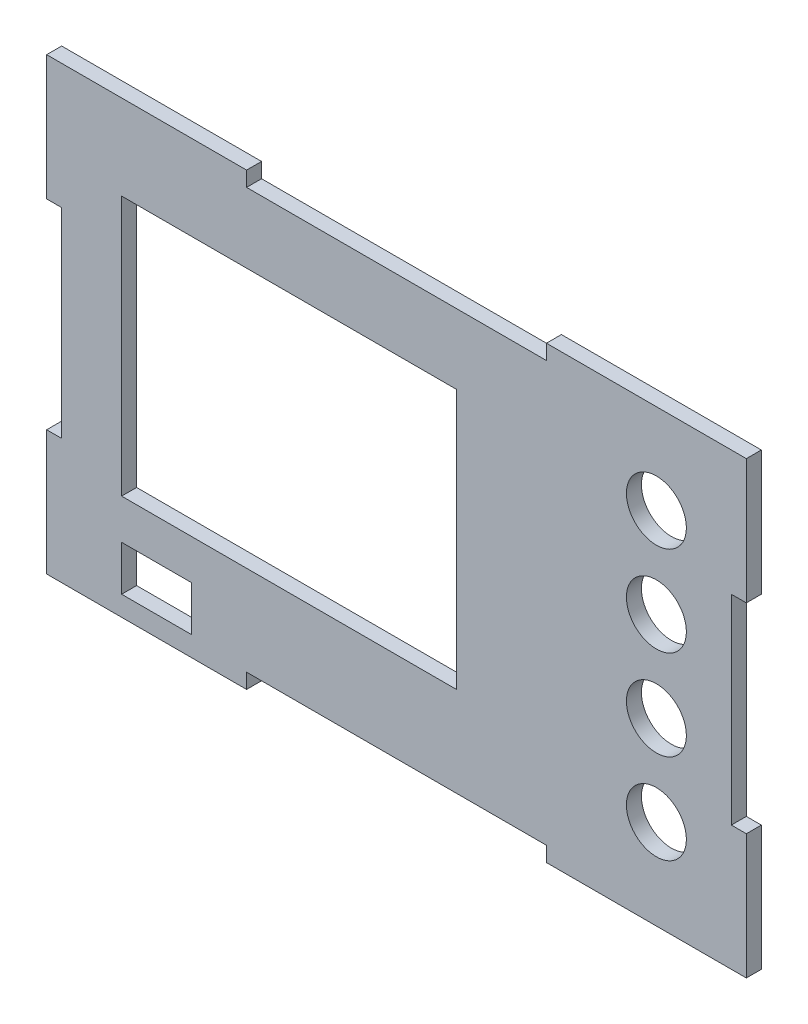
ISO-10303-21;
HEADER;
FILE_DESCRIPTION(('STEP AP214'),'2;1');
FILE_NAME('part.step','',(''),(''),'','','');
FILE_SCHEMA(('AUTOMOTIVE_DESIGN { 1 0 10303 214 1 1 1 1 }'));
ENDSEC;
DATA;
#1=APPLICATION_CONTEXT('core data for automotive mechanical design processes');
#2=APPLICATION_PROTOCOL_DEFINITION('international standard','automotive_design',2000,#1);
#3=PRODUCT_CONTEXT('',#1,'mechanical');
#4=PRODUCT('Part','Part','',(#3));
#5=PRODUCT_RELATED_PRODUCT_CATEGORY('part','',(#4));
#6=PRODUCT_DEFINITION_FORMATION('','',#4);
#7=PRODUCT_DEFINITION_CONTEXT('part definition',#1,'design');
#8=PRODUCT_DEFINITION('design','',#6,#7);
#9=PRODUCT_DEFINITION_SHAPE('','',#8);
#10=(LENGTH_UNIT() NAMED_UNIT(*) SI_UNIT(.MILLI.,.METRE.));
#11=(NAMED_UNIT(*) PLANE_ANGLE_UNIT() SI_UNIT($,.RADIAN.));
#12=(NAMED_UNIT(*) SI_UNIT($,.STERADIAN.) SOLID_ANGLE_UNIT());
#13=UNCERTAINTY_MEASURE_WITH_UNIT(LENGTH_MEASURE(1.E-05),#10,'distance_accuracy_value','');
#14=(GEOMETRIC_REPRESENTATION_CONTEXT(3) GLOBAL_UNCERTAINTY_ASSIGNED_CONTEXT((#13)) GLOBAL_UNIT_ASSIGNED_CONTEXT((#10,
#11,#12)) REPRESENTATION_CONTEXT('',''));
#15=CARTESIAN_POINT('',(0.,0.,0.));
#16=DIRECTION('',(0.,0.,1.));
#17=DIRECTION('',(1.,0.,0.));
#18=AXIS2_PLACEMENT_3D('',#15,#16,#17);
#19=CARTESIAN_POINT('',(0.,0.,3.));
#20=DIRECTION('',(1.,0.,0.));
#21=DIRECTION('',(0.,0.,-1.));
#22=AXIS2_PLACEMENT_3D('',#19,#20,#21);
#23=PLANE('',#22);
#24=DIRECTION('',(0.,-1.,0.));
#25=VECTOR('',#24,1.);
#26=CARTESIAN_POINT('',(0.,0.,0.));
#27=LINE('',#26,#25);
#28=CARTESIAN_POINT('',(0.,25.,0.));
#29=VERTEX_POINT('',#28);
#30=CARTESIAN_POINT('',(0.,0.,0.));
#31=VERTEX_POINT('',#30);
#32=EDGE_CURVE('E311',#29,#31,#27,.T.);
#33=ORIENTED_EDGE('',*,*,#32,.T.);
#34=DIRECTION('',(0.,0.,-1.));
#35=VECTOR('',#34,1.);
#36=CARTESIAN_POINT('',(0.,0.,3.));
#37=LINE('',#36,#35);
#38=CARTESIAN_POINT('',(0.,0.,3.));
#39=VERTEX_POINT('',#38);
#40=EDGE_CURVE('E11',#39,#31,#37,.T.);
#41=ORIENTED_EDGE('',*,*,#40,.F.);
#42=DIRECTION('',(0.,-1.,0.));
#43=VECTOR('',#42,1.);
#44=CARTESIAN_POINT('',(0.,0.,3.));
#45=LINE('',#44,#43);
#46=CARTESIAN_POINT('',(0.,25.,3.));
#47=VERTEX_POINT('',#46);
#48=EDGE_CURVE('E321',#47,#39,#45,.T.);
#49=ORIENTED_EDGE('',*,*,#48,.F.);
#50=DIRECTION('',(0.,0.,-1.));
#51=VECTOR('',#50,1.);
#52=CARTESIAN_POINT('',(0.,25.,3.));
#53=LINE('',#52,#51);
#54=EDGE_CURVE('E383',#47,#29,#53,.T.);
#55=ORIENTED_EDGE('',*,*,#54,.T.);
#56=EDGE_LOOP('',(#33,#41,#49,#55));
#57=FACE_BOUND('',#56,.T.);
#58=ADVANCED_FACE('F38',(#57),#23,.F.);
#59=CARTESIAN_POINT('',(0.,0.,3.));
#60=DIRECTION('',(0.,1.,0.));
#61=DIRECTION('',(0.,0.,1.));
#62=AXIS2_PLACEMENT_3D('',#59,#60,#61);
#63=PLANE('',#62);
#64=DIRECTION('',(1.,0.,0.));
#65=VECTOR('',#64,1.);
#66=CARTESIAN_POINT('',(0.,0.,0.));
#67=LINE('',#66,#65);
#68=CARTESIAN_POINT('',(40.,0.,0.));
#69=VERTEX_POINT('',#68);
#70=EDGE_CURVE('E387',#31,#69,#67,.T.);
#71=ORIENTED_EDGE('',*,*,#70,.T.);
#72=DIRECTION('',(0.,0.,-1.));
#73=VECTOR('',#72,1.);
#74=CARTESIAN_POINT('',(40.,0.,3.));
#75=LINE('',#74,#73);
#76=CARTESIAN_POINT('',(40.,0.,3.));
#77=VERTEX_POINT('',#76);
#78=EDGE_CURVE('E46',#77,#69,#75,.T.);
#79=ORIENTED_EDGE('',*,*,#78,.F.);
#80=DIRECTION('',(1.,0.,0.));
#81=VECTOR('',#80,1.);
#82=CARTESIAN_POINT('',(0.,0.,3.));
#83=LINE('',#82,#81);
#84=EDGE_CURVE('E325',#39,#77,#83,.T.);
#85=ORIENTED_EDGE('',*,*,#84,.F.);
#86=ORIENTED_EDGE('',*,*,#40,.T.);
#87=EDGE_LOOP('',(#71,#79,#85,#86));
#88=FACE_BOUND('',#87,.T.);
#89=ADVANCED_FACE('F542',(#88),#63,.F.);
#90=CARTESIAN_POINT('',(40.,0.,3.));
#91=DIRECTION('',(-1.,0.,0.));
#92=DIRECTION('',(0.,0.,1.));
#93=AXIS2_PLACEMENT_3D('',#90,#91,#92);
#94=PLANE('',#93);
#95=DIRECTION('',(0.,1.,0.));
#96=VECTOR('',#95,1.);
#97=CARTESIAN_POINT('',(40.,0.,0.));
#98=LINE('',#97,#96);
#99=CARTESIAN_POINT('',(40.,3.,0.));
#100=VERTEX_POINT('',#99);
#101=EDGE_CURVE('E390',#69,#100,#98,.T.);
#102=ORIENTED_EDGE('',*,*,#101,.T.);
#103=DIRECTION('',(0.,0.,-1.));
#104=VECTOR('',#103,1.);
#105=CARTESIAN_POINT('',(40.,3.,3.));
#106=LINE('',#105,#104);
#107=CARTESIAN_POINT('',(40.,3.,3.));
#108=VERTEX_POINT('',#107);
#109=EDGE_CURVE('E510',#108,#100,#106,.T.);
#110=ORIENTED_EDGE('',*,*,#109,.F.);
#111=DIRECTION('',(0.,1.,0.));
#112=VECTOR('',#111,1.);
#113=CARTESIAN_POINT('',(40.,0.,3.));
#114=LINE('',#113,#112);
#115=EDGE_CURVE('E329',#77,#108,#114,.T.);
#116=ORIENTED_EDGE('',*,*,#115,.F.);
#117=ORIENTED_EDGE('',*,*,#78,.T.);
#118=EDGE_LOOP('',(#102,#110,#116,#117));
#119=FACE_BOUND('',#118,.T.);
#120=ADVANCED_FACE('F520',(#119),#94,.F.);
#121=CARTESIAN_POINT('',(40.,3.,3.));
#122=DIRECTION('',(0.,1.,0.));
#123=DIRECTION('',(-1.,0.,0.));
#124=AXIS2_PLACEMENT_3D('',#121,#122,#123);
#125=PLANE('',#124);
#126=DIRECTION('',(1.,0.,0.));
#127=VECTOR('',#126,1.);
#128=CARTESIAN_POINT('',(40.,3.,0.));
#129=LINE('',#128,#127);
#130=CARTESIAN_POINT('',(100.,3.,0.));
#131=VERTEX_POINT('',#130);
#132=EDGE_CURVE('E393',#100,#131,#129,.T.);
#133=ORIENTED_EDGE('',*,*,#132,.T.);
#134=DIRECTION('',(0.,0.,-1.));
#135=VECTOR('',#134,1.);
#136=CARTESIAN_POINT('',(100.,3.,3.));
#137=LINE('',#136,#135);
#138=CARTESIAN_POINT('',(100.,3.,3.));
#139=VERTEX_POINT('',#138);
#140=EDGE_CURVE('E506',#139,#131,#137,.T.);
#141=ORIENTED_EDGE('',*,*,#140,.F.);
#142=DIRECTION('',(1.,0.,0.));
#143=VECTOR('',#142,1.);
#144=CARTESIAN_POINT('',(40.,3.,3.));
#145=LINE('',#144,#143);
#146=EDGE_CURVE('E332',#108,#139,#145,.T.);
#147=ORIENTED_EDGE('',*,*,#146,.F.);
#148=ORIENTED_EDGE('',*,*,#109,.T.);
#149=EDGE_LOOP('',(#133,#141,#147,#148));
#150=FACE_BOUND('',#149,.T.);
#151=ADVANCED_FACE('F530',(#150),#125,.F.);
#152=CARTESIAN_POINT('',(100.,0.,3.));
#153=DIRECTION('',(1.,0.,0.));
#154=DIRECTION('',(0.,0.,-1.));
#155=AXIS2_PLACEMENT_3D('',#152,#153,#154);
#156=PLANE('',#155);
#157=DIRECTION('',(0.,-1.,0.));
#158=VECTOR('',#157,1.);
#159=CARTESIAN_POINT('',(100.,0.,0.));
#160=LINE('',#159,#158);
#161=CARTESIAN_POINT('',(100.,0.,0.));
#162=VERTEX_POINT('',#161);
#163=EDGE_CURVE('E396',#131,#162,#160,.T.);
#164=ORIENTED_EDGE('',*,*,#163,.T.);
#165=DIRECTION('',(0.,0.,-1.));
#166=VECTOR('',#165,1.);
#167=CARTESIAN_POINT('',(100.,0.,3.));
#168=LINE('',#167,#166);
#169=CARTESIAN_POINT('',(100.,0.,3.));
#170=VERTEX_POINT('',#169);
#171=EDGE_CURVE('E502',#170,#162,#168,.T.);
#172=ORIENTED_EDGE('',*,*,#171,.F.);
#173=DIRECTION('',(0.,-1.,0.));
#174=VECTOR('',#173,1.);
#175=CARTESIAN_POINT('',(100.,0.,3.));
#176=LINE('',#175,#174);
#177=EDGE_CURVE('E335',#139,#170,#176,.T.);
#178=ORIENTED_EDGE('',*,*,#177,.F.);
#179=ORIENTED_EDGE('',*,*,#140,.T.);
#180=EDGE_LOOP('',(#164,#172,#178,#179));
#181=FACE_BOUND('',#180,.T.);
#182=ADVANCED_FACE('F534',(#181),#156,.F.);
#183=CARTESIAN_POINT('',(140.,0.,3.));
#184=DIRECTION('',(0.,1.,0.));
#185=DIRECTION('',(0.,0.,1.));
#186=AXIS2_PLACEMENT_3D('',#183,#184,#185);
#187=PLANE('',#186);
#188=DIRECTION('',(1.,0.,0.));
#189=VECTOR('',#188,1.);
#190=CARTESIAN_POINT('',(140.,0.,0.));
#191=LINE('',#190,#189);
#192=CARTESIAN_POINT('',(140.,0.,0.));
#193=VERTEX_POINT('',#192);
#194=EDGE_CURVE('E399',#162,#193,#191,.T.);
#195=ORIENTED_EDGE('',*,*,#194,.T.);
#196=DIRECTION('',(0.,0.,-1.));
#197=VECTOR('',#196,1.);
#198=CARTESIAN_POINT('',(140.,0.,3.));
#199=LINE('',#198,#197);
#200=CARTESIAN_POINT('',(140.,0.,3.));
#201=VERTEX_POINT('',#200);
#202=EDGE_CURVE('E498',#201,#193,#199,.T.);
#203=ORIENTED_EDGE('',*,*,#202,.F.);
#204=DIRECTION('',(1.,0.,0.));
#205=VECTOR('',#204,1.);
#206=CARTESIAN_POINT('',(140.,0.,3.));
#207=LINE('',#206,#205);
#208=EDGE_CURVE('E338',#170,#201,#207,.T.);
#209=ORIENTED_EDGE('',*,*,#208,.F.);
#210=ORIENTED_EDGE('',*,*,#171,.T.);
#211=EDGE_LOOP('',(#195,#203,#209,#210));
#212=FACE_BOUND('',#211,.T.);
#213=ADVANCED_FACE('F615',(#212),#187,.F.);
#214=CARTESIAN_POINT('',(140.,0.,3.));
#215=DIRECTION('',(-1.,0.,0.));
#216=DIRECTION('',(0.,0.,1.));
#217=AXIS2_PLACEMENT_3D('',#214,#215,#216);
#218=PLANE('',#217);
#219=DIRECTION('',(0.,1.,0.));
#220=VECTOR('',#219,1.);
#221=CARTESIAN_POINT('',(140.,0.,0.));
#222=LINE('',#221,#220);
#223=CARTESIAN_POINT('',(140.,25.,0.));
#224=VERTEX_POINT('',#223);
#225=EDGE_CURVE('E402',#193,#224,#222,.T.);
#226=ORIENTED_EDGE('',*,*,#225,.T.);
#227=DIRECTION('',(0.,0.,-1.));
#228=VECTOR('',#227,1.);
#229=CARTESIAN_POINT('',(140.,25.,3.));
#230=LINE('',#229,#228);
#231=CARTESIAN_POINT('',(140.,25.,3.));
#232=VERTEX_POINT('',#231);
#233=EDGE_CURVE('E494',#232,#224,#230,.T.);
#234=ORIENTED_EDGE('',*,*,#233,.F.);
#235=DIRECTION('',(0.,1.,0.));
#236=VECTOR('',#235,1.);
#237=CARTESIAN_POINT('',(140.,0.,3.));
#238=LINE('',#237,#236);
#239=EDGE_CURVE('E341',#201,#232,#238,.T.);
#240=ORIENTED_EDGE('',*,*,#239,.F.);
#241=ORIENTED_EDGE('',*,*,#202,.T.);
#242=EDGE_LOOP('',(#226,#234,#240,#241));
#243=FACE_BOUND('',#242,.T.);
#244=ADVANCED_FACE('F613',(#243),#218,.F.);
#245=CARTESIAN_POINT('',(140.,25.,3.));
#246=DIRECTION('',(0.,-1.,0.));
#247=DIRECTION('',(0.,0.,-1.));
#248=AXIS2_PLACEMENT_3D('',#245,#246,#247);
#249=PLANE('',#248);
#250=DIRECTION('',(-1.,0.,0.));
#251=VECTOR('',#250,1.);
#252=CARTESIAN_POINT('',(140.,25.,0.));
#253=LINE('',#252,#251);
#254=CARTESIAN_POINT('',(137.,25.,0.));
#255=VERTEX_POINT('',#254);
#256=EDGE_CURVE('E405',#224,#255,#253,.T.);
#257=ORIENTED_EDGE('',*,*,#256,.T.);
#258=DIRECTION('',(0.,0.,-1.));
#259=VECTOR('',#258,1.);
#260=CARTESIAN_POINT('',(137.,25.,3.));
#261=LINE('',#260,#259);
#262=CARTESIAN_POINT('',(137.,25.,3.));
#263=VERTEX_POINT('',#262);
#264=EDGE_CURVE('E490',#263,#255,#261,.T.);
#265=ORIENTED_EDGE('',*,*,#264,.F.);
#266=DIRECTION('',(-1.,0.,0.));
#267=VECTOR('',#266,1.);
#268=CARTESIAN_POINT('',(140.,25.,3.));
#269=LINE('',#268,#267);
#270=EDGE_CURVE('E344',#232,#263,#269,.T.);
#271=ORIENTED_EDGE('',*,*,#270,.F.);
#272=ORIENTED_EDGE('',*,*,#233,.T.);
#273=EDGE_LOOP('',(#257,#265,#271,#272));
#274=FACE_BOUND('',#273,.T.);
#275=ADVANCED_FACE('F608',(#274),#249,.F.);
#276=CARTESIAN_POINT('',(137.,25.,3.));
#277=DIRECTION('',(-1.,0.,0.));
#278=DIRECTION('',(0.,0.,1.));
#279=AXIS2_PLACEMENT_3D('',#276,#277,#278);
#280=PLANE('',#279);
#281=DIRECTION('',(0.,1.,0.));
#282=VECTOR('',#281,1.);
#283=CARTESIAN_POINT('',(137.,25.,0.));
#284=LINE('',#283,#282);
#285=CARTESIAN_POINT('',(137.,65.,0.));
#286=VERTEX_POINT('',#285);
#287=EDGE_CURVE('E408',#255,#286,#284,.T.);
#288=ORIENTED_EDGE('',*,*,#287,.T.);
#289=DIRECTION('',(0.,0.,-1.));
#290=VECTOR('',#289,1.);
#291=CARTESIAN_POINT('',(137.,65.,3.));
#292=LINE('',#291,#290);
#293=CARTESIAN_POINT('',(137.,65.,3.));
#294=VERTEX_POINT('',#293);
#295=EDGE_CURVE('E486',#294,#286,#292,.T.);
#296=ORIENTED_EDGE('',*,*,#295,.F.);
#297=DIRECTION('',(0.,1.,0.));
#298=VECTOR('',#297,1.);
#299=CARTESIAN_POINT('',(137.,25.,3.));
#300=LINE('',#299,#298);
#301=EDGE_CURVE('E347',#263,#294,#300,.T.);
#302=ORIENTED_EDGE('',*,*,#301,.F.);
#303=ORIENTED_EDGE('',*,*,#264,.T.);
#304=EDGE_LOOP('',(#288,#296,#302,#303));
#305=FACE_BOUND('',#304,.T.);
#306=ADVANCED_FACE('F603',(#305),#280,.F.);
#307=CARTESIAN_POINT('',(140.,65.,3.));
#308=DIRECTION('',(0.,1.,0.));
#309=DIRECTION('',(0.,0.,1.));
#310=AXIS2_PLACEMENT_3D('',#307,#308,#309);
#311=PLANE('',#310);
#312=DIRECTION('',(1.,0.,0.));
#313=VECTOR('',#312,1.);
#314=CARTESIAN_POINT('',(140.,65.,0.));
#315=LINE('',#314,#313);
#316=CARTESIAN_POINT('',(140.,65.,0.));
#317=VERTEX_POINT('',#316);
#318=EDGE_CURVE('E411',#286,#317,#315,.T.);
#319=ORIENTED_EDGE('',*,*,#318,.T.);
#320=DIRECTION('',(0.,0.,-1.));
#321=VECTOR('',#320,1.);
#322=CARTESIAN_POINT('',(140.,65.,3.));
#323=LINE('',#322,#321);
#324=CARTESIAN_POINT('',(140.,65.,3.));
#325=VERTEX_POINT('',#324);
#326=EDGE_CURVE('E482',#325,#317,#323,.T.);
#327=ORIENTED_EDGE('',*,*,#326,.F.);
#328=DIRECTION('',(1.,0.,0.));
#329=VECTOR('',#328,1.);
#330=CARTESIAN_POINT('',(140.,65.,3.));
#331=LINE('',#330,#329);
#332=EDGE_CURVE('E350',#294,#325,#331,.T.);
#333=ORIENTED_EDGE('',*,*,#332,.F.);
#334=ORIENTED_EDGE('',*,*,#295,.T.);
#335=EDGE_LOOP('',(#319,#327,#333,#334));
#336=FACE_BOUND('',#335,.T.);
#337=ADVANCED_FACE('F599',(#336),#311,.F.);
#338=CARTESIAN_POINT('',(140.,90.,3.));
#339=DIRECTION('',(-1.,0.,0.));
#340=DIRECTION('',(0.,0.,1.));
#341=AXIS2_PLACEMENT_3D('',#338,#339,#340);
#342=PLANE('',#341);
#343=DIRECTION('',(0.,1.,0.));
#344=VECTOR('',#343,1.);
#345=CARTESIAN_POINT('',(140.,90.,0.));
#346=LINE('',#345,#344);
#347=CARTESIAN_POINT('',(140.,90.,0.));
#348=VERTEX_POINT('',#347);
#349=EDGE_CURVE('E414',#317,#348,#346,.T.);
#350=ORIENTED_EDGE('',*,*,#349,.T.);
#351=DIRECTION('',(0.,0.,-1.));
#352=VECTOR('',#351,1.);
#353=CARTESIAN_POINT('',(140.,90.,3.));
#354=LINE('',#353,#352);
#355=CARTESIAN_POINT('',(140.,90.,3.));
#356=VERTEX_POINT('',#355);
#357=EDGE_CURVE('E478',#356,#348,#354,.T.);
#358=ORIENTED_EDGE('',*,*,#357,.F.);
#359=DIRECTION('',(0.,1.,0.));
#360=VECTOR('',#359,1.);
#361=CARTESIAN_POINT('',(140.,90.,3.));
#362=LINE('',#361,#360);
#363=EDGE_CURVE('E353',#325,#356,#362,.T.);
#364=ORIENTED_EDGE('',*,*,#363,.F.);
#365=ORIENTED_EDGE('',*,*,#326,.T.);
#366=EDGE_LOOP('',(#350,#358,#364,#365));
#367=FACE_BOUND('',#366,.T.);
#368=ADVANCED_FACE('F594',(#367),#342,.F.);
#369=CARTESIAN_POINT('',(140.,90.,3.));
#370=DIRECTION('',(0.,-1.,0.));
#371=DIRECTION('',(0.,0.,-1.));
#372=AXIS2_PLACEMENT_3D('',#369,#370,#371);
#373=PLANE('',#372);
#374=DIRECTION('',(-1.,0.,0.));
#375=VECTOR('',#374,1.);
#376=CARTESIAN_POINT('',(140.,90.,0.));
#377=LINE('',#376,#375);
#378=CARTESIAN_POINT('',(100.,90.,0.));
#379=VERTEX_POINT('',#378);
#380=EDGE_CURVE('E417',#348,#379,#377,.T.);
#381=ORIENTED_EDGE('',*,*,#380,.T.);
#382=DIRECTION('',(0.,0.,-1.));
#383=VECTOR('',#382,1.);
#384=CARTESIAN_POINT('',(100.,90.,3.));
#385=LINE('',#384,#383);
#386=CARTESIAN_POINT('',(100.,90.,3.));
#387=VERTEX_POINT('',#386);
#388=EDGE_CURVE('E474',#387,#379,#385,.T.);
#389=ORIENTED_EDGE('',*,*,#388,.F.);
#390=DIRECTION('',(-1.,0.,0.));
#391=VECTOR('',#390,1.);
#392=CARTESIAN_POINT('',(140.,90.,3.));
#393=LINE('',#392,#391);
#394=EDGE_CURVE('E356',#356,#387,#393,.T.);
#395=ORIENTED_EDGE('',*,*,#394,.F.);
#396=ORIENTED_EDGE('',*,*,#357,.T.);
#397=EDGE_LOOP('',(#381,#389,#395,#396));
#398=FACE_BOUND('',#397,.T.);
#399=ADVANCED_FACE('F588',(#398),#373,.F.);
#400=CARTESIAN_POINT('',(100.,90.,3.));
#401=DIRECTION('',(1.,0.,0.));
#402=DIRECTION('',(0.,0.,-1.));
#403=AXIS2_PLACEMENT_3D('',#400,#401,#402);
#404=PLANE('',#403);
#405=DIRECTION('',(0.,-1.,0.));
#406=VECTOR('',#405,1.);
#407=CARTESIAN_POINT('',(100.,90.,0.));
#408=LINE('',#407,#406);
#409=CARTESIAN_POINT('',(100.,87.,0.));
#410=VERTEX_POINT('',#409);
#411=EDGE_CURVE('E420',#379,#410,#408,.T.);
#412=ORIENTED_EDGE('',*,*,#411,.T.);
#413=DIRECTION('',(0.,0.,-1.));
#414=VECTOR('',#413,1.);
#415=CARTESIAN_POINT('',(100.,87.,3.));
#416=LINE('',#415,#414);
#417=CARTESIAN_POINT('',(100.,87.,3.));
#418=VERTEX_POINT('',#417);
#419=EDGE_CURVE('E470',#418,#410,#416,.T.);
#420=ORIENTED_EDGE('',*,*,#419,.F.);
#421=DIRECTION('',(0.,-1.,0.));
#422=VECTOR('',#421,1.);
#423=CARTESIAN_POINT('',(100.,90.,3.));
#424=LINE('',#423,#422);
#425=EDGE_CURVE('E359',#387,#418,#424,.T.);
#426=ORIENTED_EDGE('',*,*,#425,.F.);
#427=ORIENTED_EDGE('',*,*,#388,.T.);
#428=EDGE_LOOP('',(#412,#420,#426,#427));
#429=FACE_BOUND('',#428,.T.);
#430=ADVANCED_FACE('F584',(#429),#404,.F.);
#431=CARTESIAN_POINT('',(40.,87.,3.));
#432=DIRECTION('',(0.,-1.,0.));
#433=DIRECTION('',(0.,0.,-1.));
#434=AXIS2_PLACEMENT_3D('',#431,#432,#433);
#435=PLANE('',#434);
#436=DIRECTION('',(-1.,0.,0.));
#437=VECTOR('',#436,1.);
#438=CARTESIAN_POINT('',(40.,87.,0.));
#439=LINE('',#438,#437);
#440=CARTESIAN_POINT('',(40.,87.,0.));
#441=VERTEX_POINT('',#440);
#442=EDGE_CURVE('E423',#410,#441,#439,.T.);
#443=ORIENTED_EDGE('',*,*,#442,.T.);
#444=DIRECTION('',(0.,0.,-1.));
#445=VECTOR('',#444,1.);
#446=CARTESIAN_POINT('',(40.,87.,3.));
#447=LINE('',#446,#445);
#448=CARTESIAN_POINT('',(40.,87.,3.));
#449=VERTEX_POINT('',#448);
#450=EDGE_CURVE('E466',#449,#441,#447,.T.);
#451=ORIENTED_EDGE('',*,*,#450,.F.);
#452=DIRECTION('',(-1.,0.,0.));
#453=VECTOR('',#452,1.);
#454=CARTESIAN_POINT('',(40.,87.,3.));
#455=LINE('',#454,#453);
#456=EDGE_CURVE('E362',#418,#449,#455,.T.);
#457=ORIENTED_EDGE('',*,*,#456,.F.);
#458=ORIENTED_EDGE('',*,*,#419,.T.);
#459=EDGE_LOOP('',(#443,#451,#457,#458));
#460=FACE_BOUND('',#459,.T.);
#461=ADVANCED_FACE('F579',(#460),#435,.F.);
#462=CARTESIAN_POINT('',(40.,90.,3.));
#463=DIRECTION('',(-1.,0.,0.));
#464=DIRECTION('',(0.,0.,1.));
#465=AXIS2_PLACEMENT_3D('',#462,#463,#464);
#466=PLANE('',#465);
#467=DIRECTION('',(0.,1.,0.));
#468=VECTOR('',#467,1.);
#469=CARTESIAN_POINT('',(40.,90.,0.));
#470=LINE('',#469,#468);
#471=CARTESIAN_POINT('',(40.,90.,0.));
#472=VERTEX_POINT('',#471);
#473=EDGE_CURVE('E426',#441,#472,#470,.T.);
#474=ORIENTED_EDGE('',*,*,#473,.T.);
#475=DIRECTION('',(0.,0.,-1.));
#476=VECTOR('',#475,1.);
#477=CARTESIAN_POINT('',(40.,90.,3.));
#478=LINE('',#477,#476);
#479=CARTESIAN_POINT('',(40.,90.,3.));
#480=VERTEX_POINT('',#479);
#481=EDGE_CURVE('E462',#480,#472,#478,.T.);
#482=ORIENTED_EDGE('',*,*,#481,.F.);
#483=DIRECTION('',(0.,1.,0.));
#484=VECTOR('',#483,1.);
#485=CARTESIAN_POINT('',(40.,90.,3.));
#486=LINE('',#485,#484);
#487=EDGE_CURVE('E365',#449,#480,#486,.T.);
#488=ORIENTED_EDGE('',*,*,#487,.F.);
#489=ORIENTED_EDGE('',*,*,#450,.T.);
#490=EDGE_LOOP('',(#474,#482,#488,#489));
#491=FACE_BOUND('',#490,.T.);
#492=ADVANCED_FACE('F573',(#491),#466,.F.);
#493=CARTESIAN_POINT('',(0.,90.,3.));
#494=DIRECTION('',(0.,-1.,0.));
#495=DIRECTION('',(0.,0.,-1.));
#496=AXIS2_PLACEMENT_3D('',#493,#494,#495);
#497=PLANE('',#496);
#498=DIRECTION('',(-1.,0.,0.));
#499=VECTOR('',#498,1.);
#500=CARTESIAN_POINT('',(0.,90.,0.));
#501=LINE('',#500,#499);
#502=CARTESIAN_POINT('',(0.,90.,0.));
#503=VERTEX_POINT('',#502);
#504=EDGE_CURVE('E429',#472,#503,#501,.T.);
#505=ORIENTED_EDGE('',*,*,#504,.T.);
#506=DIRECTION('',(0.,0.,-1.));
#507=VECTOR('',#506,1.);
#508=CARTESIAN_POINT('',(0.,90.,3.));
#509=LINE('',#508,#507);
#510=CARTESIAN_POINT('',(0.,90.,3.));
#511=VERTEX_POINT('',#510);
#512=EDGE_CURVE('E458',#511,#503,#509,.T.);
#513=ORIENTED_EDGE('',*,*,#512,.F.);
#514=DIRECTION('',(-1.,0.,0.));
#515=VECTOR('',#514,1.);
#516=CARTESIAN_POINT('',(0.,90.,3.));
#517=LINE('',#516,#515);
#518=EDGE_CURVE('E368',#480,#511,#517,.T.);
#519=ORIENTED_EDGE('',*,*,#518,.F.);
#520=ORIENTED_EDGE('',*,*,#481,.T.);
#521=EDGE_LOOP('',(#505,#513,#519,#520));
#522=FACE_BOUND('',#521,.T.);
#523=ADVANCED_FACE('F569',(#522),#497,.F.);
#524=CARTESIAN_POINT('',(0.,90.,3.));
#525=DIRECTION('',(1.,0.,0.));
#526=DIRECTION('',(0.,0.,-1.));
#527=AXIS2_PLACEMENT_3D('',#524,#525,#526);
#528=PLANE('',#527);
#529=DIRECTION('',(0.,-1.,0.));
#530=VECTOR('',#529,1.);
#531=CARTESIAN_POINT('',(0.,90.,0.));
#532=LINE('',#531,#530);
#533=CARTESIAN_POINT('',(0.,65.,0.));
#534=VERTEX_POINT('',#533);
#535=EDGE_CURVE('E432',#503,#534,#532,.T.);
#536=ORIENTED_EDGE('',*,*,#535,.T.);
#537=DIRECTION('',(0.,0.,-1.));
#538=VECTOR('',#537,1.);
#539=CARTESIAN_POINT('',(0.,65.,3.));
#540=LINE('',#539,#538);
#541=CARTESIAN_POINT('',(0.,65.,3.));
#542=VERTEX_POINT('',#541);
#543=EDGE_CURVE('E454',#542,#534,#540,.T.);
#544=ORIENTED_EDGE('',*,*,#543,.F.);
#545=DIRECTION('',(0.,-1.,0.));
#546=VECTOR('',#545,1.);
#547=CARTESIAN_POINT('',(0.,90.,3.));
#548=LINE('',#547,#546);
#549=EDGE_CURVE('E371',#511,#542,#548,.T.);
#550=ORIENTED_EDGE('',*,*,#549,.F.);
#551=ORIENTED_EDGE('',*,*,#512,.T.);
#552=EDGE_LOOP('',(#536,#544,#550,#551));
#553=FACE_BOUND('',#552,.T.);
#554=ADVANCED_FACE('F564',(#553),#528,.F.);
#555=CARTESIAN_POINT('',(0.,65.,3.));
#556=DIRECTION('',(0.,1.,0.));
#557=DIRECTION('',(0.,0.,1.));
#558=AXIS2_PLACEMENT_3D('',#555,#556,#557);
#559=PLANE('',#558);
#560=DIRECTION('',(1.,0.,0.));
#561=VECTOR('',#560,1.);
#562=CARTESIAN_POINT('',(0.,65.,0.));
#563=LINE('',#562,#561);
#564=CARTESIAN_POINT('',(3.,65.,0.));
#565=VERTEX_POINT('',#564);
#566=EDGE_CURVE('E435',#534,#565,#563,.T.);
#567=ORIENTED_EDGE('',*,*,#566,.T.);
#568=DIRECTION('',(0.,0.,-1.));
#569=VECTOR('',#568,1.);
#570=CARTESIAN_POINT('',(3.,65.,3.));
#571=LINE('',#570,#569);
#572=CARTESIAN_POINT('',(3.,65.,3.));
#573=VERTEX_POINT('',#572);
#574=EDGE_CURVE('E450',#573,#565,#571,.T.);
#575=ORIENTED_EDGE('',*,*,#574,.F.);
#576=DIRECTION('',(1.,0.,0.));
#577=VECTOR('',#576,1.);
#578=CARTESIAN_POINT('',(0.,65.,3.));
#579=LINE('',#578,#577);
#580=EDGE_CURVE('E374',#542,#573,#579,.T.);
#581=ORIENTED_EDGE('',*,*,#580,.F.);
#582=ORIENTED_EDGE('',*,*,#543,.T.);
#583=EDGE_LOOP('',(#567,#575,#581,#582));
#584=FACE_BOUND('',#583,.T.);
#585=ADVANCED_FACE('F558',(#584),#559,.F.);
#586=CARTESIAN_POINT('',(3.,25.,3.));
#587=DIRECTION('',(1.,0.,0.));
#588=DIRECTION('',(0.,0.,-1.));
#589=AXIS2_PLACEMENT_3D('',#586,#587,#588);
#590=PLANE('',#589);
#591=DIRECTION('',(0.,-1.,0.));
#592=VECTOR('',#591,1.);
#593=CARTESIAN_POINT('',(3.,25.,0.));
#594=LINE('',#593,#592);
#595=CARTESIAN_POINT('',(3.,25.,0.));
#596=VERTEX_POINT('',#595);
#597=EDGE_CURVE('E438',#565,#596,#594,.T.);
#598=ORIENTED_EDGE('',*,*,#597,.T.);
#599=DIRECTION('',(0.,0.,-1.));
#600=VECTOR('',#599,1.);
#601=CARTESIAN_POINT('',(3.,25.,3.));
#602=LINE('',#601,#600);
#603=CARTESIAN_POINT('',(3.,25.,3.));
#604=VERTEX_POINT('',#603);
#605=EDGE_CURVE('E446',#604,#596,#602,.T.);
#606=ORIENTED_EDGE('',*,*,#605,.F.);
#607=DIRECTION('',(0.,-1.,0.));
#608=VECTOR('',#607,1.);
#609=CARTESIAN_POINT('',(3.,25.,3.));
#610=LINE('',#609,#608);
#611=EDGE_CURVE('E377',#573,#604,#610,.T.);
#612=ORIENTED_EDGE('',*,*,#611,.F.);
#613=ORIENTED_EDGE('',*,*,#574,.T.);
#614=EDGE_LOOP('',(#598,#606,#612,#613));
#615=FACE_BOUND('',#614,.T.);
#616=ADVANCED_FACE('F554',(#615),#590,.F.);
#617=CARTESIAN_POINT('',(0.,25.,3.));
#618=DIRECTION('',(0.,-1.,0.));
#619=DIRECTION('',(0.,0.,-1.));
#620=AXIS2_PLACEMENT_3D('',#617,#618,#619);
#621=PLANE('',#620);
#622=DIRECTION('',(-1.,0.,0.));
#623=VECTOR('',#622,1.);
#624=CARTESIAN_POINT('',(0.,25.,0.));
#625=LINE('',#624,#623);
#626=EDGE_CURVE('E326',#596,#29,#625,.T.);
#627=ORIENTED_EDGE('',*,*,#626,.T.);
#628=ORIENTED_EDGE('',*,*,#54,.F.);
#629=DIRECTION('',(-1.,0.,0.));
#630=VECTOR('',#629,1.);
#631=CARTESIAN_POINT('',(0.,25.,3.));
#632=LINE('',#631,#630);
#633=EDGE_CURVE('E380',#604,#47,#632,.T.);
#634=ORIENTED_EDGE('',*,*,#633,.F.);
#635=ORIENTED_EDGE('',*,*,#605,.T.);
#636=EDGE_LOOP('',(#627,#628,#634,#635));
#637=FACE_BOUND('',#636,.T.);
#638=ADVANCED_FACE('F549',(#637),#621,.F.);
#639=CARTESIAN_POINT('',(0.,0.,3.));
#640=DIRECTION('',(0.,0.,-1.));
#641=DIRECTION('',(-1.,0.,0.));
#642=AXIS2_PLACEMENT_3D('',#639,#640,#641);
#643=PLANE('',#642);
#644=CARTESIAN_POINT('',(122.,72.,3.));
#645=DIRECTION('',(0.,0.,1.));
#646=DIRECTION('',(1.,0.,0.));
#647=AXIS2_PLACEMENT_3D('',#644,#645,#646);
#648=CIRCLE('',#647,6.);
#649=CARTESIAN_POINT('',(128.,72.,3.));
#650=VERTEX_POINT('',#649);
#651=EDGE_CURVE('E898',#650,#650,#648,.T.);
#652=ORIENTED_EDGE('',*,*,#651,.F.);
#653=EDGE_LOOP('',(#652));
#654=FACE_BOUND('',#653,.T.);
#655=CARTESIAN_POINT('',(122.,36.,3.));
#656=DIRECTION('',(0.,0.,1.));
#657=DIRECTION('',(1.,0.,0.));
#658=AXIS2_PLACEMENT_3D('',#655,#656,#657);
#659=CIRCLE('',#658,5.99999999999999);
#660=CARTESIAN_POINT('',(128.,36.,3.));
#661=VERTEX_POINT('',#660);
#662=EDGE_CURVE('E914',#661,#661,#659,.T.);
#663=ORIENTED_EDGE('',*,*,#662,.F.);
#664=EDGE_LOOP('',(#663));
#665=FACE_BOUND('',#664,.T.);
#666=CARTESIAN_POINT('',(122.,54.,3.));
#667=DIRECTION('',(0.,0.,1.));
#668=DIRECTION('',(1.,0.,0.));
#669=AXIS2_PLACEMENT_3D('',#666,#667,#668);
#670=CIRCLE('',#669,5.99999999999997);
#671=CARTESIAN_POINT('',(128.,54.,3.));
#672=VERTEX_POINT('',#671);
#673=EDGE_CURVE('E252',#672,#672,#670,.T.);
#674=ORIENTED_EDGE('',*,*,#673,.F.);
#675=EDGE_LOOP('',(#674));
#676=FACE_BOUND('',#675,.T.);
#677=CARTESIAN_POINT('',(122.000000000001,18.,3.));
#678=DIRECTION('',(0.,0.,1.));
#679=DIRECTION('',(1.,0.,0.));
#680=AXIS2_PLACEMENT_3D('',#677,#678,#679);
#681=CIRCLE('',#680,5.99999999999999);
#682=CARTESIAN_POINT('',(128.000000000001,18.,3.));
#683=VERTEX_POINT('',#682);
#684=EDGE_CURVE('E907',#683,#683,#681,.T.);
#685=ORIENTED_EDGE('',*,*,#684,.F.);
#686=EDGE_LOOP('',(#685));
#687=FACE_BOUND('',#686,.T.);
#688=DIRECTION('',(1.,0.,0.));
#689=VECTOR('',#688,1.);
#690=CARTESIAN_POINT('',(15.,21.,3.));
#691=LINE('',#690,#689);
#692=CARTESIAN_POINT('',(15.,21.,3.));
#693=VERTEX_POINT('',#692);
#694=CARTESIAN_POINT('',(82.,21.,3.));
#695=VERTEX_POINT('',#694);
#696=EDGE_CURVE('E261',#693,#695,#691,.T.);
#697=ORIENTED_EDGE('',*,*,#696,.F.);
#698=DIRECTION('',(0.,-1.,0.));
#699=VECTOR('',#698,1.);
#700=CARTESIAN_POINT('',(15.,21.,3.));
#701=LINE('',#700,#699);
#702=CARTESIAN_POINT('',(15.,73.,3.));
#703=VERTEX_POINT('',#702);
#704=EDGE_CURVE('E53',#703,#693,#701,.T.);
#705=ORIENTED_EDGE('',*,*,#704,.F.);
#706=DIRECTION('',(-1.,0.,0.));
#707=VECTOR('',#706,1.);
#708=CARTESIAN_POINT('',(15.,73.,3.));
#709=LINE('',#708,#707);
#710=CARTESIAN_POINT('',(82.,73.,3.));
#711=VERTEX_POINT('',#710);
#712=EDGE_CURVE('E244',#711,#703,#709,.T.);
#713=ORIENTED_EDGE('',*,*,#712,.F.);
#714=DIRECTION('',(0.,1.,0.));
#715=VECTOR('',#714,1.);
#716=CARTESIAN_POINT('',(82.,21.,3.));
#717=LINE('',#716,#715);
#718=EDGE_CURVE('E249',#695,#711,#717,.T.);
#719=ORIENTED_EDGE('',*,*,#718,.F.);
#720=EDGE_LOOP('',(#697,#705,#713,#719));
#721=FACE_BOUND('',#720,.T.);
#722=DIRECTION('',(1.,0.,0.));
#723=VECTOR('',#722,1.);
#724=CARTESIAN_POINT('',(15.,4.,3.));
#725=LINE('',#724,#723);
#726=CARTESIAN_POINT('',(15.,4.,3.));
#727=VERTEX_POINT('',#726);
#728=CARTESIAN_POINT('',(29.,4.,3.));
#729=VERTEX_POINT('',#728);
#730=EDGE_CURVE('E297',#727,#729,#725,.T.);
#731=ORIENTED_EDGE('',*,*,#730,.F.);
#732=DIRECTION('',(0.,-1.,0.));
#733=VECTOR('',#732,1.);
#734=CARTESIAN_POINT('',(15.,4.,3.));
#735=LINE('',#734,#733);
#736=CARTESIAN_POINT('',(15.,13.,3.));
#737=VERTEX_POINT('',#736);
#738=EDGE_CURVE('E271',#737,#727,#735,.T.);
#739=ORIENTED_EDGE('',*,*,#738,.F.);
#740=DIRECTION('',(-1.,0.,0.));
#741=VECTOR('',#740,1.);
#742=CARTESIAN_POINT('',(15.,13.,3.));
#743=LINE('',#742,#741);
#744=CARTESIAN_POINT('',(29.,13.,3.));
#745=VERTEX_POINT('',#744);
#746=EDGE_CURVE('E282',#745,#737,#743,.T.);
#747=ORIENTED_EDGE('',*,*,#746,.F.);
#748=DIRECTION('',(0.,1.,0.));
#749=VECTOR('',#748,1.);
#750=CARTESIAN_POINT('',(29.,4.,3.));
#751=LINE('',#750,#749);
#752=EDGE_CURVE('E301',#729,#745,#751,.T.);
#753=ORIENTED_EDGE('',*,*,#752,.F.);
#754=EDGE_LOOP('',(#731,#739,#747,#753));
#755=FACE_BOUND('',#754,.T.);
#756=ORIENTED_EDGE('',*,*,#48,.T.);
#757=ORIENTED_EDGE('',*,*,#84,.T.);
#758=ORIENTED_EDGE('',*,*,#115,.T.);
#759=ORIENTED_EDGE('',*,*,#146,.T.);
#760=ORIENTED_EDGE('',*,*,#177,.T.);
#761=ORIENTED_EDGE('',*,*,#208,.T.);
#762=ORIENTED_EDGE('',*,*,#239,.T.);
#763=ORIENTED_EDGE('',*,*,#270,.T.);
#764=ORIENTED_EDGE('',*,*,#301,.T.);
#765=ORIENTED_EDGE('',*,*,#332,.T.);
#766=ORIENTED_EDGE('',*,*,#363,.T.);
#767=ORIENTED_EDGE('',*,*,#394,.T.);
#768=ORIENTED_EDGE('',*,*,#425,.T.);
#769=ORIENTED_EDGE('',*,*,#456,.T.);
#770=ORIENTED_EDGE('',*,*,#487,.T.);
#771=ORIENTED_EDGE('',*,*,#518,.T.);
#772=ORIENTED_EDGE('',*,*,#549,.T.);
#773=ORIENTED_EDGE('',*,*,#580,.T.);
#774=ORIENTED_EDGE('',*,*,#611,.T.);
#775=ORIENTED_EDGE('',*,*,#633,.T.);
#776=EDGE_LOOP('',(#756,#757,#758,#759,#760,#761,#762,#763,#764,#765,#766,#767,#768,#769,#770,
#771,#772,#773,#774,#775));
#777=FACE_BOUND('',#776,.T.);
#778=ADVANCED_FACE('F538',(#654,#665,#676,#687,#721,#755,#777),#643,.F.);
#779=CARTESIAN_POINT('',(0.,0.,0.));
#780=DIRECTION('',(0.,0.,-1.));
#781=DIRECTION('',(-1.,0.,0.));
#782=AXIS2_PLACEMENT_3D('',#779,#780,#781);
#783=PLANE('',#782);
#784=CARTESIAN_POINT('',(122.,72.,0.));
#785=DIRECTION('',(0.,0.,1.));
#786=DIRECTION('',(1.,0.,0.));
#787=AXIS2_PLACEMENT_3D('',#784,#785,#786);
#788=CIRCLE('',#787,6.);
#789=CARTESIAN_POINT('',(128.,72.,0.));
#790=VERTEX_POINT('',#789);
#791=EDGE_CURVE('E262',#790,#790,#788,.T.);
#792=ORIENTED_EDGE('',*,*,#791,.T.);
#793=EDGE_LOOP('',(#792));
#794=FACE_BOUND('',#793,.T.);
#795=CARTESIAN_POINT('',(122.,36.,0.));
#796=DIRECTION('',(0.,0.,1.));
#797=DIRECTION('',(1.,0.,0.));
#798=AXIS2_PLACEMENT_3D('',#795,#796,#797);
#799=CIRCLE('',#798,5.99999999999999);
#800=CARTESIAN_POINT('',(128.,36.,0.));
#801=VERTEX_POINT('',#800);
#802=EDGE_CURVE('E910',#801,#801,#799,.T.);
#803=ORIENTED_EDGE('',*,*,#802,.T.);
#804=EDGE_LOOP('',(#803));
#805=FACE_BOUND('',#804,.T.);
#806=CARTESIAN_POINT('',(122.,54.,0.));
#807=DIRECTION('',(0.,0.,1.));
#808=DIRECTION('',(1.,0.,0.));
#809=AXIS2_PLACEMENT_3D('',#806,#807,#808);
#810=CIRCLE('',#809,5.99999999999997);
#811=CARTESIAN_POINT('',(128.,54.,0.));
#812=VERTEX_POINT('',#811);
#813=EDGE_CURVE('E920',#812,#812,#810,.T.);
#814=ORIENTED_EDGE('',*,*,#813,.T.);
#815=EDGE_LOOP('',(#814));
#816=FACE_BOUND('',#815,.T.);
#817=CARTESIAN_POINT('',(122.000000000001,18.,0.));
#818=DIRECTION('',(0.,0.,1.));
#819=DIRECTION('',(1.,0.,0.));
#820=AXIS2_PLACEMENT_3D('',#817,#818,#819);
#821=CIRCLE('',#820,5.99999999999999);
#822=CARTESIAN_POINT('',(128.000000000001,18.,0.));
#823=VERTEX_POINT('',#822);
#824=EDGE_CURVE('E900',#823,#823,#821,.T.);
#825=ORIENTED_EDGE('',*,*,#824,.T.);
#826=EDGE_LOOP('',(#825));
#827=FACE_BOUND('',#826,.T.);
#828=DIRECTION('',(0.,-1.,0.));
#829=VECTOR('',#828,1.);
#830=CARTESIAN_POINT('',(15.,21.,0.));
#831=LINE('',#830,#829);
#832=CARTESIAN_POINT('',(15.,73.,0.));
#833=VERTEX_POINT('',#832);
#834=CARTESIAN_POINT('',(15.,21.,0.));
#835=VERTEX_POINT('',#834);
#836=EDGE_CURVE('E225',#833,#835,#831,.T.);
#837=ORIENTED_EDGE('',*,*,#836,.T.);
#838=DIRECTION('',(1.,0.,0.));
#839=VECTOR('',#838,1.);
#840=CARTESIAN_POINT('',(15.,21.,0.));
#841=LINE('',#840,#839);
#842=CARTESIAN_POINT('',(82.,21.,0.));
#843=VERTEX_POINT('',#842);
#844=EDGE_CURVE('E235',#835,#843,#841,.T.);
#845=ORIENTED_EDGE('',*,*,#844,.T.);
#846=DIRECTION('',(0.,1.,0.));
#847=VECTOR('',#846,1.);
#848=CARTESIAN_POINT('',(82.,21.,0.));
#849=LINE('',#848,#847);
#850=CARTESIAN_POINT('',(82.,73.,0.));
#851=VERTEX_POINT('',#850);
#852=EDGE_CURVE('E61',#843,#851,#849,.T.);
#853=ORIENTED_EDGE('',*,*,#852,.T.);
#854=DIRECTION('',(-1.,0.,0.));
#855=VECTOR('',#854,1.);
#856=CARTESIAN_POINT('',(15.,73.,0.));
#857=LINE('',#856,#855);
#858=EDGE_CURVE('E232',#851,#833,#857,.T.);
#859=ORIENTED_EDGE('',*,*,#858,.T.);
#860=EDGE_LOOP('',(#837,#845,#853,#859));
#861=FACE_BOUND('',#860,.T.);
#862=DIRECTION('',(0.,-1.,0.));
#863=VECTOR('',#862,1.);
#864=CARTESIAN_POINT('',(15.,4.,0.));
#865=LINE('',#864,#863);
#866=CARTESIAN_POINT('',(15.,13.,0.));
#867=VERTEX_POINT('',#866);
#868=CARTESIAN_POINT('',(15.,4.,0.));
#869=VERTEX_POINT('',#868);
#870=EDGE_CURVE('E277',#867,#869,#865,.T.);
#871=ORIENTED_EDGE('',*,*,#870,.T.);
#872=DIRECTION('',(1.,0.,0.));
#873=VECTOR('',#872,1.);
#874=CARTESIAN_POINT('',(15.,4.,0.));
#875=LINE('',#874,#873);
#876=CARTESIAN_POINT('',(29.,4.,0.));
#877=VERTEX_POINT('',#876);
#878=EDGE_CURVE('E281',#869,#877,#875,.T.);
#879=ORIENTED_EDGE('',*,*,#878,.T.);
#880=DIRECTION('',(0.,1.,0.));
#881=VECTOR('',#880,1.);
#882=CARTESIAN_POINT('',(29.,4.,0.));
#883=LINE('',#882,#881);
#884=CARTESIAN_POINT('',(29.,13.,0.));
#885=VERTEX_POINT('',#884);
#886=EDGE_CURVE('E286',#877,#885,#883,.T.);
#887=ORIENTED_EDGE('',*,*,#886,.T.);
#888=DIRECTION('',(-1.,0.,0.));
#889=VECTOR('',#888,1.);
#890=CARTESIAN_POINT('',(15.,13.,0.));
#891=LINE('',#890,#889);
#892=EDGE_CURVE('E290',#885,#867,#891,.T.);
#893=ORIENTED_EDGE('',*,*,#892,.T.);
#894=EDGE_LOOP('',(#871,#879,#887,#893));
#895=FACE_BOUND('',#894,.T.);
#896=ORIENTED_EDGE('',*,*,#32,.F.);
#897=ORIENTED_EDGE('',*,*,#626,.F.);
#898=ORIENTED_EDGE('',*,*,#597,.F.);
#899=ORIENTED_EDGE('',*,*,#566,.F.);
#900=ORIENTED_EDGE('',*,*,#535,.F.);
#901=ORIENTED_EDGE('',*,*,#504,.F.);
#902=ORIENTED_EDGE('',*,*,#473,.F.);
#903=ORIENTED_EDGE('',*,*,#442,.F.);
#904=ORIENTED_EDGE('',*,*,#411,.F.);
#905=ORIENTED_EDGE('',*,*,#380,.F.);
#906=ORIENTED_EDGE('',*,*,#349,.F.);
#907=ORIENTED_EDGE('',*,*,#318,.F.);
#908=ORIENTED_EDGE('',*,*,#287,.F.);
#909=ORIENTED_EDGE('',*,*,#256,.F.);
#910=ORIENTED_EDGE('',*,*,#225,.F.);
#911=ORIENTED_EDGE('',*,*,#194,.F.);
#912=ORIENTED_EDGE('',*,*,#163,.F.);
#913=ORIENTED_EDGE('',*,*,#132,.F.);
#914=ORIENTED_EDGE('',*,*,#101,.F.);
#915=ORIENTED_EDGE('',*,*,#70,.F.);
#916=EDGE_LOOP('',(#896,#897,#898,#899,#900,#901,#902,#903,#904,#905,#906,#907,#908,#909,#910,
#911,#912,#913,#914,#915));
#917=FACE_BOUND('',#916,.T.);
#918=ADVANCED_FACE('F240',(#794,#805,#816,#827,#861,#895,#917),#783,.T.);
#919=CARTESIAN_POINT('',(15.,4.,0.));
#920=DIRECTION('',(-1.,0.,0.));
#921=DIRECTION('',(0.,0.,1.));
#922=AXIS2_PLACEMENT_3D('',#919,#920,#921);
#923=PLANE('',#922);
#924=ORIENTED_EDGE('',*,*,#738,.T.);
#925=DIRECTION('',(0.,0.,1.));
#926=VECTOR('',#925,1.);
#927=CARTESIAN_POINT('',(15.,4.,0.));
#928=LINE('',#927,#926);
#929=EDGE_CURVE('E294',#869,#727,#928,.T.);
#930=ORIENTED_EDGE('',*,*,#929,.F.);
#931=ORIENTED_EDGE('',*,*,#870,.F.);
#932=DIRECTION('',(0.,0.,1.));
#933=VECTOR('',#932,1.);
#934=CARTESIAN_POINT('',(15.,13.,0.));
#935=LINE('',#934,#933);
#936=EDGE_CURVE('E308',#867,#737,#935,.T.);
#937=ORIENTED_EDGE('',*,*,#936,.T.);
#938=EDGE_LOOP('',(#924,#930,#931,#937));
#939=FACE_BOUND('',#938,.T.);
#940=ADVANCED_FACE('F774',(#939),#923,.F.);
#941=CARTESIAN_POINT('',(15.,13.,0.));
#942=DIRECTION('',(0.,1.,0.));
#943=DIRECTION('',(0.,0.,1.));
#944=AXIS2_PLACEMENT_3D('',#941,#942,#943);
#945=PLANE('',#944);
#946=ORIENTED_EDGE('',*,*,#746,.T.);
#947=ORIENTED_EDGE('',*,*,#936,.F.);
#948=ORIENTED_EDGE('',*,*,#892,.F.);
#949=DIRECTION('',(0.,0.,1.));
#950=VECTOR('',#949,1.);
#951=CARTESIAN_POINT('',(29.,13.,0.));
#952=LINE('',#951,#950);
#953=EDGE_CURVE('E312',#885,#745,#952,.T.);
#954=ORIENTED_EDGE('',*,*,#953,.T.);
#955=EDGE_LOOP('',(#946,#947,#948,#954));
#956=FACE_BOUND('',#955,.T.);
#957=ADVANCED_FACE('F784',(#956),#945,.F.);
#958=CARTESIAN_POINT('',(29.,4.,0.));
#959=DIRECTION('',(1.,0.,0.));
#960=DIRECTION('',(0.,0.,-1.));
#961=AXIS2_PLACEMENT_3D('',#958,#959,#960);
#962=PLANE('',#961);
#963=ORIENTED_EDGE('',*,*,#752,.T.);
#964=ORIENTED_EDGE('',*,*,#953,.F.);
#965=ORIENTED_EDGE('',*,*,#886,.F.);
#966=DIRECTION('',(0.,0.,1.));
#967=VECTOR('',#966,1.);
#968=CARTESIAN_POINT('',(29.,4.,0.));
#969=LINE('',#968,#967);
#970=EDGE_CURVE('E315',#877,#729,#969,.T.);
#971=ORIENTED_EDGE('',*,*,#970,.T.);
#972=EDGE_LOOP('',(#963,#964,#965,#971));
#973=FACE_BOUND('',#972,.T.);
#974=ADVANCED_FACE('F794',(#973),#962,.F.);
#975=CARTESIAN_POINT('',(15.,4.,0.));
#976=DIRECTION('',(0.,-1.,0.));
#977=DIRECTION('',(0.,0.,-1.));
#978=AXIS2_PLACEMENT_3D('',#975,#976,#977);
#979=PLANE('',#978);
#980=ORIENTED_EDGE('',*,*,#730,.T.);
#981=ORIENTED_EDGE('',*,*,#970,.F.);
#982=ORIENTED_EDGE('',*,*,#878,.F.);
#983=ORIENTED_EDGE('',*,*,#929,.T.);
#984=EDGE_LOOP('',(#980,#981,#982,#983));
#985=FACE_BOUND('',#984,.T.);
#986=ADVANCED_FACE('F804',(#985),#979,.F.);
#987=CARTESIAN_POINT('',(15.,21.,0.));
#988=DIRECTION('',(-1.,0.,0.));
#989=DIRECTION('',(0.,0.,1.));
#990=AXIS2_PLACEMENT_3D('',#987,#988,#989);
#991=PLANE('',#990);
#992=ORIENTED_EDGE('',*,*,#704,.T.);
#993=DIRECTION('',(0.,0.,1.));
#994=VECTOR('',#993,1.);
#995=CARTESIAN_POINT('',(15.,21.,0.));
#996=LINE('',#995,#994);
#997=EDGE_CURVE('E221',#835,#693,#996,.T.);
#998=ORIENTED_EDGE('',*,*,#997,.F.);
#999=ORIENTED_EDGE('',*,*,#836,.F.);
#1000=DIRECTION('',(0.,0.,1.));
#1001=VECTOR('',#1000,1.);
#1002=CARTESIAN_POINT('',(15.,73.,0.));
#1003=LINE('',#1002,#1001);
#1004=EDGE_CURVE('E268',#833,#703,#1003,.T.);
#1005=ORIENTED_EDGE('',*,*,#1004,.T.);
#1006=EDGE_LOOP('',(#992,#998,#999,#1005));
#1007=FACE_BOUND('',#1006,.T.);
#1008=ADVANCED_FACE('F223',(#1007),#991,.F.);
#1009=CARTESIAN_POINT('',(15.,73.,0.));
#1010=DIRECTION('',(0.,1.,0.));
#1011=DIRECTION('',(0.,0.,1.));
#1012=AXIS2_PLACEMENT_3D('',#1009,#1010,#1011);
#1013=PLANE('',#1012);
#1014=ORIENTED_EDGE('',*,*,#712,.T.);
#1015=ORIENTED_EDGE('',*,*,#1004,.F.);
#1016=ORIENTED_EDGE('',*,*,#858,.F.);
#1017=DIRECTION('',(0.,0.,1.));
#1018=VECTOR('',#1017,1.);
#1019=CARTESIAN_POINT('',(82.,73.,0.));
#1020=LINE('',#1019,#1018);
#1021=EDGE_CURVE('E272',#851,#711,#1020,.T.);
#1022=ORIENTED_EDGE('',*,*,#1021,.T.);
#1023=EDGE_LOOP('',(#1014,#1015,#1016,#1022));
#1024=FACE_BOUND('',#1023,.T.);
#1025=ADVANCED_FACE('F823',(#1024),#1013,.F.);
#1026=CARTESIAN_POINT('',(82.,21.,0.));
#1027=DIRECTION('',(1.,0.,0.));
#1028=DIRECTION('',(0.,0.,-1.));
#1029=AXIS2_PLACEMENT_3D('',#1026,#1027,#1028);
#1030=PLANE('',#1029);
#1031=ORIENTED_EDGE('',*,*,#718,.T.);
#1032=ORIENTED_EDGE('',*,*,#1021,.F.);
#1033=ORIENTED_EDGE('',*,*,#852,.F.);
#1034=DIRECTION('',(0.,0.,1.));
#1035=VECTOR('',#1034,1.);
#1036=CARTESIAN_POINT('',(82.,21.,0.));
#1037=LINE('',#1036,#1035);
#1038=EDGE_CURVE('E231',#843,#695,#1037,.T.);
#1039=ORIENTED_EDGE('',*,*,#1038,.T.);
#1040=EDGE_LOOP('',(#1031,#1032,#1033,#1039));
#1041=FACE_BOUND('',#1040,.T.);
#1042=ADVANCED_FACE('F832',(#1041),#1030,.F.);
#1043=CARTESIAN_POINT('',(15.,21.,0.));
#1044=DIRECTION('',(0.,-1.,0.));
#1045=DIRECTION('',(0.,0.,-1.));
#1046=AXIS2_PLACEMENT_3D('',#1043,#1044,#1045);
#1047=PLANE('',#1046);
#1048=ORIENTED_EDGE('',*,*,#696,.T.);
#1049=ORIENTED_EDGE('',*,*,#1038,.F.);
#1050=ORIENTED_EDGE('',*,*,#844,.F.);
#1051=ORIENTED_EDGE('',*,*,#997,.T.);
#1052=EDGE_LOOP('',(#1048,#1049,#1050,#1051));
#1053=FACE_BOUND('',#1052,.T.);
#1054=ADVANCED_FACE('F236',(#1053),#1047,.F.);
#1055=CARTESIAN_POINT('',(122.000000000001,18.,0.));
#1056=DIRECTION('',(0.,0.,1.));
#1057=DIRECTION('',(1.,0.,0.));
#1058=AXIS2_PLACEMENT_3D('',#1055,#1056,#1057);
#1059=CYLINDRICAL_SURFACE('',#1058,5.99999999999999);
#1060=ORIENTED_EDGE('',*,*,#824,.F.);
#1061=EDGE_LOOP('',(#1060));
#1062=FACE_BOUND('',#1061,.T.);
#1063=ORIENTED_EDGE('',*,*,#684,.T.);
#1064=EDGE_LOOP('',(#1063));
#1065=FACE_BOUND('',#1064,.T.);
#1066=ADVANCED_FACE('F850',(#1062,#1065),#1059,.F.);
#1067=CARTESIAN_POINT('',(122.,54.,0.));
#1068=DIRECTION('',(0.,0.,1.));
#1069=DIRECTION('',(1.,0.,0.));
#1070=AXIS2_PLACEMENT_3D('',#1067,#1068,#1069);
#1071=CYLINDRICAL_SURFACE('',#1070,5.99999999999997);
#1072=ORIENTED_EDGE('',*,*,#813,.F.);
#1073=EDGE_LOOP('',(#1072));
#1074=FACE_BOUND('',#1073,.T.);
#1075=ORIENTED_EDGE('',*,*,#673,.T.);
#1076=EDGE_LOOP('',(#1075));
#1077=FACE_BOUND('',#1076,.T.);
#1078=ADVANCED_FACE('F859',(#1074,#1077),#1071,.F.);
#1079=CARTESIAN_POINT('',(122.,36.,0.));
#1080=DIRECTION('',(0.,0.,1.));
#1081=DIRECTION('',(1.,0.,0.));
#1082=AXIS2_PLACEMENT_3D('',#1079,#1080,#1081);
#1083=CYLINDRICAL_SURFACE('',#1082,5.99999999999999);
#1084=ORIENTED_EDGE('',*,*,#802,.F.);
#1085=EDGE_LOOP('',(#1084));
#1086=FACE_BOUND('',#1085,.T.);
#1087=ORIENTED_EDGE('',*,*,#662,.T.);
#1088=EDGE_LOOP('',(#1087));
#1089=FACE_BOUND('',#1088,.T.);
#1090=ADVANCED_FACE('F869',(#1086,#1089),#1083,.F.);
#1091=CARTESIAN_POINT('',(122.,72.,0.));
#1092=DIRECTION('',(0.,0.,1.));
#1093=DIRECTION('',(1.,0.,0.));
#1094=AXIS2_PLACEMENT_3D('',#1091,#1092,#1093);
#1095=CYLINDRICAL_SURFACE('',#1094,6.);
#1096=ORIENTED_EDGE('',*,*,#791,.F.);
#1097=EDGE_LOOP('',(#1096));
#1098=FACE_BOUND('',#1097,.T.);
#1099=ORIENTED_EDGE('',*,*,#651,.T.);
#1100=EDGE_LOOP('',(#1099));
#1101=FACE_BOUND('',#1100,.T.);
#1102=ADVANCED_FACE('F879',(#1098,#1101),#1095,.F.);
#1103=CLOSED_SHELL('',(#58,#89,#120,#151,#182,#213,#244,#275,#306,#337,#368,#399,#430,#461,#492,
#523,#554,#585,#616,#638,#778,#918,#940,#957,#974,#986,#1008,#1025,#1042,#1054,#1066,#1078,
#1090,#1102));
#1104=MANIFOLD_SOLID_BREP('B2',#1103);
#1105=ADVANCED_BREP_SHAPE_REPRESENTATION('',(#18,#1104),#14);
#1106=SHAPE_DEFINITION_REPRESENTATION(#9,#1105);
ENDSEC;
END-ISO-10303-21;
